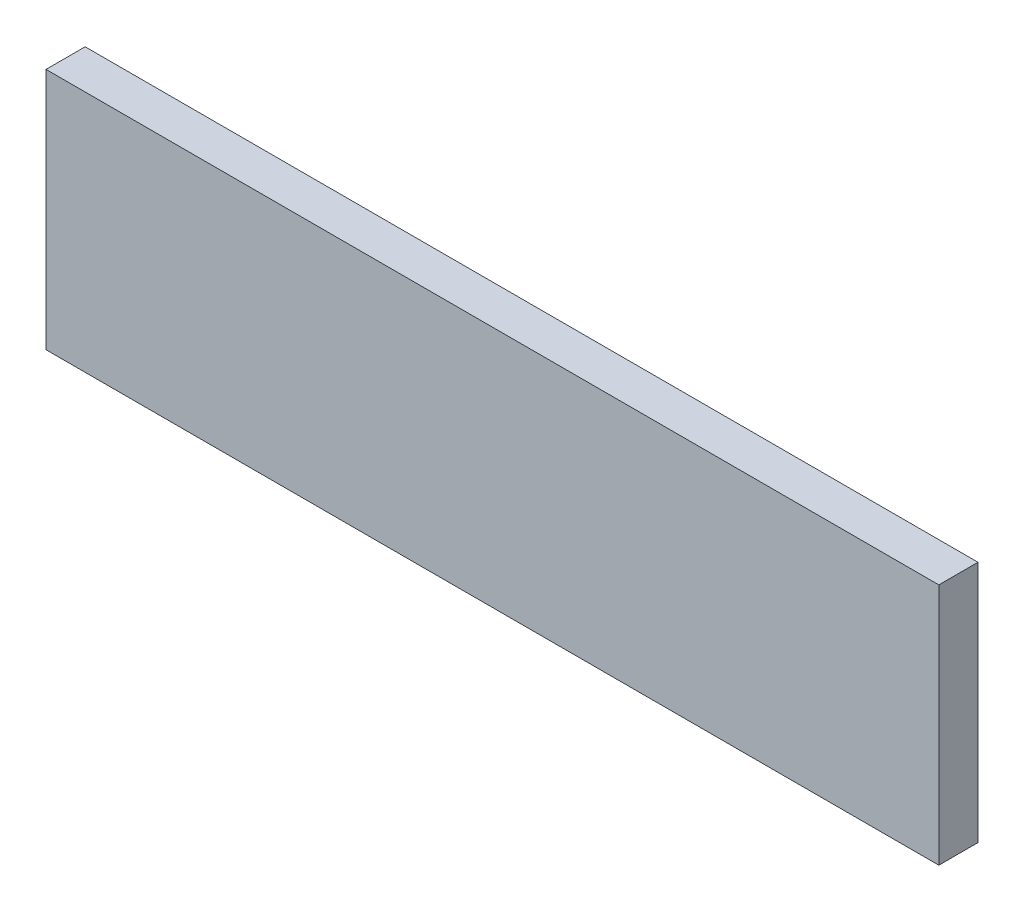
ISO-10303-21;
HEADER;
FILE_DESCRIPTION(('STEP AP214'),'2;1');
FILE_NAME('part.step','',(''),(''),'','','');
FILE_SCHEMA(('AUTOMOTIVE_DESIGN { 1 0 10303 214 1 1 1 1 }'));
ENDSEC;
DATA;
#1=APPLICATION_CONTEXT('core data for automotive mechanical design processes');
#2=APPLICATION_PROTOCOL_DEFINITION('international standard','automotive_design',2000,#1);
#3=PRODUCT_CONTEXT('',#1,'mechanical');
#4=PRODUCT('Part','Part','',(#3));
#5=PRODUCT_RELATED_PRODUCT_CATEGORY('part','',(#4));
#6=PRODUCT_DEFINITION_FORMATION('','',#4);
#7=PRODUCT_DEFINITION_CONTEXT('part definition',#1,'design');
#8=PRODUCT_DEFINITION('design','',#6,#7);
#9=PRODUCT_DEFINITION_SHAPE('','',#8);
#10=(LENGTH_UNIT() NAMED_UNIT(*) SI_UNIT(.MILLI.,.METRE.));
#11=(NAMED_UNIT(*) PLANE_ANGLE_UNIT() SI_UNIT($,.RADIAN.));
#12=(NAMED_UNIT(*) SI_UNIT($,.STERADIAN.) SOLID_ANGLE_UNIT());
#13=UNCERTAINTY_MEASURE_WITH_UNIT(LENGTH_MEASURE(1.E-05),#10,'distance_accuracy_value','');
#14=(GEOMETRIC_REPRESENTATION_CONTEXT(3) GLOBAL_UNCERTAINTY_ASSIGNED_CONTEXT((#13)) GLOBAL_UNIT_ASSIGNED_CONTEXT((#10,
#11,#12)) REPRESENTATION_CONTEXT('',''));
#15=CARTESIAN_POINT('',(0.,0.,0.));
#16=DIRECTION('',(0.,0.,1.));
#17=DIRECTION('',(1.,0.,0.));
#18=AXIS2_PLACEMENT_3D('',#15,#16,#17);
#19=CARTESIAN_POINT('',(0.,0.,10.));
#20=DIRECTION('',(1.,0.,0.));
#21=DIRECTION('',(0.,0.,-1.));
#22=AXIS2_PLACEMENT_3D('',#19,#20,#21);
#23=PLANE('',#22);
#24=DIRECTION('',(0.,-1.,0.));
#25=VECTOR('',#24,1.);
#26=CARTESIAN_POINT('',(0.,0.,0.));
#27=LINE('',#26,#25);
#28=CARTESIAN_POINT('',(0.,62.,0.));
#29=VERTEX_POINT('',#28);
#30=CARTESIAN_POINT('',(0.,0.,0.));
#31=VERTEX_POINT('',#30);
#32=EDGE_CURVE('E96',#29,#31,#27,.T.);
#33=ORIENTED_EDGE('',*,*,#32,.T.);
#34=DIRECTION('',(0.,0.,-1.));
#35=VECTOR('',#34,1.);
#36=CARTESIAN_POINT('',(0.,0.,10.));
#37=LINE('',#36,#35);
#38=CARTESIAN_POINT('',(0.,0.,10.));
#39=VERTEX_POINT('',#38);
#40=EDGE_CURVE('E11',#39,#31,#37,.T.);
#41=ORIENTED_EDGE('',*,*,#40,.F.);
#42=DIRECTION('',(0.,-1.,0.));
#43=VECTOR('',#42,1.);
#44=CARTESIAN_POINT('',(0.,0.,10.));
#45=LINE('',#44,#43);
#46=CARTESIAN_POINT('',(0.,62.,10.));
#47=VERTEX_POINT('',#46);
#48=EDGE_CURVE('E84',#47,#39,#45,.T.);
#49=ORIENTED_EDGE('',*,*,#48,.F.);
#50=DIRECTION('',(0.,0.,-1.));
#51=VECTOR('',#50,1.);
#52=CARTESIAN_POINT('',(0.,62.,10.));
#53=LINE('',#52,#51);
#54=EDGE_CURVE('E92',#47,#29,#53,.T.);
#55=ORIENTED_EDGE('',*,*,#54,.T.);
#56=EDGE_LOOP('',(#33,#41,#49,#55));
#57=FACE_BOUND('',#56,.T.);
#58=ADVANCED_FACE('F33',(#57),#23,.F.);
#59=CARTESIAN_POINT('',(0.,0.,10.));
#60=DIRECTION('',(0.,1.,0.));
#61=DIRECTION('',(0.,0.,1.));
#62=AXIS2_PLACEMENT_3D('',#59,#60,#61);
#63=PLANE('',#62);
#64=DIRECTION('',(1.,0.,0.));
#65=VECTOR('',#64,1.);
#66=CARTESIAN_POINT('',(0.,0.,0.));
#67=LINE('',#66,#65);
#68=CARTESIAN_POINT('',(228.,0.,0.));
#69=VERTEX_POINT('',#68);
#70=EDGE_CURVE('E88',#31,#69,#67,.T.);
#71=ORIENTED_EDGE('',*,*,#70,.T.);
#72=DIRECTION('',(0.,0.,-1.));
#73=VECTOR('',#72,1.);
#74=CARTESIAN_POINT('',(228.,0.,10.));
#75=LINE('',#74,#73);
#76=CARTESIAN_POINT('',(228.,0.,10.));
#77=VERTEX_POINT('',#76);
#78=EDGE_CURVE('E41',#77,#69,#75,.T.);
#79=ORIENTED_EDGE('',*,*,#78,.F.);
#80=DIRECTION('',(1.,0.,0.));
#81=VECTOR('',#80,1.);
#82=CARTESIAN_POINT('',(0.,0.,10.));
#83=LINE('',#82,#81);
#84=EDGE_CURVE('E79',#39,#77,#83,.T.);
#85=ORIENTED_EDGE('',*,*,#84,.F.);
#86=ORIENTED_EDGE('',*,*,#40,.T.);
#87=EDGE_LOOP('',(#71,#79,#85,#86));
#88=FACE_BOUND('',#87,.T.);
#89=ADVANCED_FACE('F87',(#88),#63,.F.);
#90=CARTESIAN_POINT('',(228.,0.,10.));
#91=DIRECTION('',(-1.,0.,0.));
#92=DIRECTION('',(0.,0.,1.));
#93=AXIS2_PLACEMENT_3D('',#90,#91,#92);
#94=PLANE('',#93);
#95=DIRECTION('',(0.,1.,0.));
#96=VECTOR('',#95,1.);
#97=CARTESIAN_POINT('',(228.,0.,0.));
#98=LINE('',#97,#96);
#99=CARTESIAN_POINT('',(228.,62.,0.));
#100=VERTEX_POINT('',#99);
#101=EDGE_CURVE('E66',#69,#100,#98,.T.);
#102=ORIENTED_EDGE('',*,*,#101,.T.);
#103=DIRECTION('',(0.,0.,-1.));
#104=VECTOR('',#103,1.);
#105=CARTESIAN_POINT('',(228.,62.,10.));
#106=LINE('',#105,#104);
#107=CARTESIAN_POINT('',(228.,62.,10.));
#108=VERTEX_POINT('',#107);
#109=EDGE_CURVE('E89',#108,#100,#106,.T.);
#110=ORIENTED_EDGE('',*,*,#109,.F.);
#111=DIRECTION('',(0.,1.,0.));
#112=VECTOR('',#111,1.);
#113=CARTESIAN_POINT('',(228.,0.,10.));
#114=LINE('',#113,#112);
#115=EDGE_CURVE('E82',#77,#108,#114,.T.);
#116=ORIENTED_EDGE('',*,*,#115,.F.);
#117=ORIENTED_EDGE('',*,*,#78,.T.);
#118=EDGE_LOOP('',(#102,#110,#116,#117));
#119=FACE_BOUND('',#118,.T.);
#120=ADVANCED_FACE('F90',(#119),#94,.F.);
#121=CARTESIAN_POINT('',(0.,62.,10.));
#122=DIRECTION('',(0.,-1.,0.));
#123=DIRECTION('',(0.,0.,-1.));
#124=AXIS2_PLACEMENT_3D('',#121,#122,#123);
#125=PLANE('',#124);
#126=DIRECTION('',(-1.,0.,0.));
#127=VECTOR('',#126,1.);
#128=CARTESIAN_POINT('',(0.,62.,0.));
#129=LINE('',#128,#127);
#130=EDGE_CURVE('E72',#100,#29,#129,.T.);
#131=ORIENTED_EDGE('',*,*,#130,.T.);
#132=ORIENTED_EDGE('',*,*,#54,.F.);
#133=DIRECTION('',(-1.,0.,0.));
#134=VECTOR('',#133,1.);
#135=CARTESIAN_POINT('',(0.,62.,10.));
#136=LINE('',#135,#134);
#137=EDGE_CURVE('E49',#108,#47,#136,.T.);
#138=ORIENTED_EDGE('',*,*,#137,.F.);
#139=ORIENTED_EDGE('',*,*,#109,.T.);
#140=EDGE_LOOP('',(#131,#132,#138,#139));
#141=FACE_BOUND('',#140,.T.);
#142=ADVANCED_FACE('F103',(#141),#125,.F.);
#143=CARTESIAN_POINT('',(0.,0.,10.));
#144=DIRECTION('',(0.,0.,-1.));
#145=DIRECTION('',(-1.,0.,0.));
#146=AXIS2_PLACEMENT_3D('',#143,#144,#145);
#147=PLANE('',#146);
#148=ORIENTED_EDGE('',*,*,#48,.T.);
#149=ORIENTED_EDGE('',*,*,#84,.T.);
#150=ORIENTED_EDGE('',*,*,#115,.T.);
#151=ORIENTED_EDGE('',*,*,#137,.T.);
#152=EDGE_LOOP('',(#148,#149,#150,#151));
#153=FACE_BOUND('',#152,.T.);
#154=ADVANCED_FACE('F80',(#153),#147,.F.);
#155=CARTESIAN_POINT('',(0.,0.,0.));
#156=DIRECTION('',(0.,0.,-1.));
#157=DIRECTION('',(-1.,0.,0.));
#158=AXIS2_PLACEMENT_3D('',#155,#156,#157);
#159=PLANE('',#158);
#160=ORIENTED_EDGE('',*,*,#32,.F.);
#161=ORIENTED_EDGE('',*,*,#130,.F.);
#162=ORIENTED_EDGE('',*,*,#101,.F.);
#163=ORIENTED_EDGE('',*,*,#70,.F.);
#164=EDGE_LOOP('',(#160,#161,#162,#163));
#165=FACE_BOUND('',#164,.T.);
#166=ADVANCED_FACE('F106',(#165),#159,.T.);
#167=CLOSED_SHELL('',(#58,#89,#120,#142,#154,#166));
#168=MANIFOLD_SOLID_BREP('B2',#167);
#169=ADVANCED_BREP_SHAPE_REPRESENTATION('',(#18,#168),#14);
#170=SHAPE_DEFINITION_REPRESENTATION(#9,#169);
ENDSEC;
END-ISO-10303-21;
